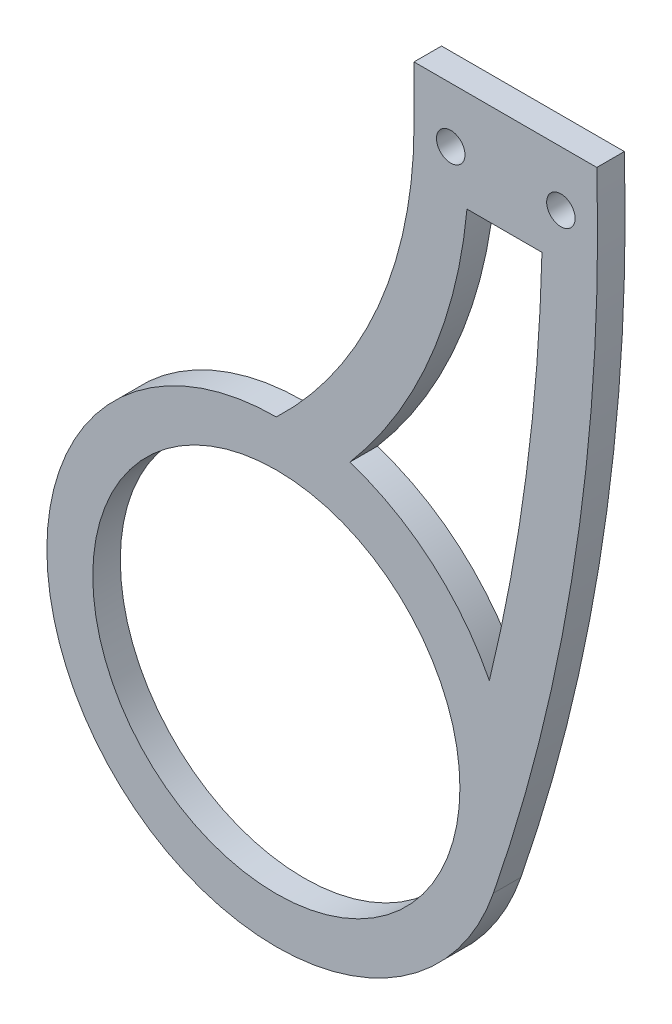
ISO-10303-21;
HEADER;
FILE_DESCRIPTION(('STEP AP214'),'2;1');
FILE_NAME('part.step','',(''),(''),'','','');
FILE_SCHEMA(('AUTOMOTIVE_DESIGN { 1 0 10303 214 1 1 1 1 }'));
ENDSEC;
DATA;
#1=APPLICATION_CONTEXT('core data for automotive mechanical design processes');
#2=APPLICATION_PROTOCOL_DEFINITION('international standard','automotive_design',2000,#1);
#3=PRODUCT_CONTEXT('',#1,'mechanical');
#4=PRODUCT('Part','Part','',(#3));
#5=PRODUCT_RELATED_PRODUCT_CATEGORY('part','',(#4));
#6=PRODUCT_DEFINITION_FORMATION('','',#4);
#7=PRODUCT_DEFINITION_CONTEXT('part definition',#1,'design');
#8=PRODUCT_DEFINITION('design','',#6,#7);
#9=PRODUCT_DEFINITION_SHAPE('','',#8);
#10=(LENGTH_UNIT() NAMED_UNIT(*) SI_UNIT(.MILLI.,.METRE.));
#11=(NAMED_UNIT(*) PLANE_ANGLE_UNIT() SI_UNIT($,.RADIAN.));
#12=(NAMED_UNIT(*) SI_UNIT($,.STERADIAN.) SOLID_ANGLE_UNIT());
#13=UNCERTAINTY_MEASURE_WITH_UNIT(LENGTH_MEASURE(1.E-05),#10,'distance_accuracy_value','');
#14=(GEOMETRIC_REPRESENTATION_CONTEXT(3) GLOBAL_UNCERTAINTY_ASSIGNED_CONTEXT((#13)) GLOBAL_UNIT_ASSIGNED_CONTEXT((#10,
#11,#12)) REPRESENTATION_CONTEXT('',''));
#15=CARTESIAN_POINT('',(0.,0.,0.));
#16=DIRECTION('',(0.,0.,1.));
#17=DIRECTION('',(1.,0.,0.));
#18=AXIS2_PLACEMENT_3D('',#15,#16,#17);
#19=CARTESIAN_POINT('',(-194.,0.,3.));
#20=DIRECTION('',(0.,0.,-1.));
#21=DIRECTION('',(-1.,0.,0.));
#22=AXIS2_PLACEMENT_3D('',#19,#20,#21);
#23=CYLINDRICAL_SURFACE('',#22,210.);
#24=CARTESIAN_POINT('',(-194.,0.,0.));
#25=DIRECTION('',(0.,0.,1.));
#26=DIRECTION('',(1.,0.,0.));
#27=AXIS2_PLACEMENT_3D('',#24,#25,#26);
#28=CIRCLE('',#27,210.);
#29=CARTESIAN_POINT('',(4.64864864864865,-68.1081081081081,0.));
#30=VERTEX_POINT('',#29);
#31=CARTESIAN_POINT('',(15.9142682144308,6.,0.));
#32=VERTEX_POINT('',#31);
#33=EDGE_CURVE('E161',#30,#32,#28,.T.);
#34=ORIENTED_EDGE('',*,*,#33,.T.);
#35=DIRECTION('',(0.,0.,-1.));
#36=VECTOR('',#35,1.);
#37=CARTESIAN_POINT('',(15.9142682144308,6.,3.));
#38=LINE('',#37,#36);
#39=CARTESIAN_POINT('',(15.9142682144308,6.,3.));
#40=VERTEX_POINT('',#39);
#41=EDGE_CURVE('E11',#40,#32,#38,.T.);
#42=ORIENTED_EDGE('',*,*,#41,.F.);
#43=CARTESIAN_POINT('',(-194.,0.,3.));
#44=DIRECTION('',(0.,0.,1.));
#45=DIRECTION('',(1.,0.,0.));
#46=AXIS2_PLACEMENT_3D('',#43,#44,#45);
#47=CIRCLE('',#46,210.);
#48=CARTESIAN_POINT('',(4.64864864864865,-68.1081081081081,3.));
#49=VERTEX_POINT('',#48);
#50=EDGE_CURVE('E135',#49,#40,#47,.T.);
#51=ORIENTED_EDGE('',*,*,#50,.F.);
#52=DIRECTION('',(0.,0.,-1.));
#53=VECTOR('',#52,1.);
#54=CARTESIAN_POINT('',(4.64864864864865,-68.1081081081081,3.));
#55=LINE('',#54,#53);
#56=EDGE_CURVE('E171',#49,#30,#55,.T.);
#57=ORIENTED_EDGE('',*,*,#56,.T.);
#58=EDGE_LOOP('',(#34,#42,#51,#57));
#59=FACE_BOUND('',#58,.T.);
#60=ADVANCED_FACE('F36',(#59),#23,.T.);
#61=CARTESIAN_POINT('',(0.,6.,3.));
#62=DIRECTION('',(0.,1.,0.));
#63=DIRECTION('',(-1.,0.,0.));
#64=AXIS2_PLACEMENT_3D('',#61,#62,#63);
#65=PLANE('',#64);
#66=DIRECTION('',(1.,0.,0.));
#67=VECTOR('',#66,1.);
#68=CARTESIAN_POINT('',(0.,6.,0.));
#69=LINE('',#68,#67);
#70=CARTESIAN_POINT('',(-4.,6.,0.));
#71=VERTEX_POINT('',#70);
#72=EDGE_CURVE('E164',#71,#32,#69,.T.);
#73=ORIENTED_EDGE('',*,*,#72,.F.);
#74=DIRECTION('',(0.,0.,-1.));
#75=VECTOR('',#74,1.);
#76=CARTESIAN_POINT('',(-4.,6.,3.));
#77=LINE('',#76,#75);
#78=CARTESIAN_POINT('',(-4.,6.,3.));
#79=VERTEX_POINT('',#78);
#80=EDGE_CURVE('E46',#79,#71,#77,.T.);
#81=ORIENTED_EDGE('',*,*,#80,.F.);
#82=DIRECTION('',(1.,0.,0.));
#83=VECTOR('',#82,1.);
#84=CARTESIAN_POINT('',(0.,6.,3.));
#85=LINE('',#84,#83);
#86=EDGE_CURVE('E133',#79,#40,#85,.T.);
#87=ORIENTED_EDGE('',*,*,#86,.T.);
#88=ORIENTED_EDGE('',*,*,#41,.T.);
#89=EDGE_LOOP('',(#73,#81,#87,#88));
#90=FACE_BOUND('',#89,.T.);
#91=ADVANCED_FACE('F220',(#90),#65,.T.);
#92=CARTESIAN_POINT('',(-4.,0.,3.));
#93=DIRECTION('',(-1.,0.,0.));
#94=DIRECTION('',(0.,-1.,0.));
#95=AXIS2_PLACEMENT_3D('',#92,#93,#94);
#96=PLANE('',#95);
#97=DIRECTION('',(0.,1.,0.));
#98=VECTOR('',#97,1.);
#99=CARTESIAN_POINT('',(-4.,0.,0.));
#100=LINE('',#99,#98);
#101=CARTESIAN_POINT('',(-4.,0.,0.));
#102=VERTEX_POINT('',#101);
#103=EDGE_CURVE('E124',#102,#71,#100,.T.);
#104=ORIENTED_EDGE('',*,*,#103,.F.);
#105=DIRECTION('',(0.,0.,-1.));
#106=VECTOR('',#105,1.);
#107=CARTESIAN_POINT('',(-4.,0.,3.));
#108=LINE('',#107,#106);
#109=CARTESIAN_POINT('',(-4.,0.,3.));
#110=VERTEX_POINT('',#109);
#111=EDGE_CURVE('E118',#110,#102,#108,.T.);
#112=ORIENTED_EDGE('',*,*,#111,.F.);
#113=DIRECTION('',(0.,1.,0.));
#114=VECTOR('',#113,1.);
#115=CARTESIAN_POINT('',(-4.,0.,3.));
#116=LINE('',#115,#114);
#117=EDGE_CURVE('E122',#110,#79,#116,.T.);
#118=ORIENTED_EDGE('',*,*,#117,.T.);
#119=ORIENTED_EDGE('',*,*,#80,.T.);
#120=EDGE_LOOP('',(#104,#112,#118,#119));
#121=FACE_BOUND('',#120,.T.);
#122=ADVANCED_FACE('F120',(#121),#96,.T.);
#123=CARTESIAN_POINT('',(-52.3333333333333,0.,3.));
#124=DIRECTION('',(0.,0.,-1.));
#125=DIRECTION('',(-1.,0.,0.));
#126=AXIS2_PLACEMENT_3D('',#123,#124,#125);
#127=CYLINDRICAL_SURFACE('',#126,48.3333333333333);
#128=CARTESIAN_POINT('',(-52.3333333333333,0.,0.));
#129=DIRECTION('',(0.,0.,1.));
#130=DIRECTION('',(1.,0.,0.));
#131=AXIS2_PLACEMENT_3D('',#128,#129,#130);
#132=CIRCLE('',#131,48.3333333333333);
#133=CARTESIAN_POINT('',(-19.,-35.,0.));
#134=VERTEX_POINT('',#133);
#135=EDGE_CURVE('E85',#102,#134,#132,.F.);
#136=ORIENTED_EDGE('',*,*,#135,.T.);
#137=DIRECTION('',(0.,0.,-1.));
#138=VECTOR('',#137,1.);
#139=CARTESIAN_POINT('',(-19.,-35.,3.));
#140=LINE('',#139,#138);
#141=CARTESIAN_POINT('',(-19.,-35.,3.));
#142=VERTEX_POINT('',#141);
#143=EDGE_CURVE('E125',#142,#134,#140,.T.);
#144=ORIENTED_EDGE('',*,*,#143,.F.);
#145=CARTESIAN_POINT('',(-52.3333333333333,0.,3.));
#146=DIRECTION('',(0.,0.,1.));
#147=DIRECTION('',(1.,0.,0.));
#148=AXIS2_PLACEMENT_3D('',#145,#146,#147);
#149=CIRCLE('',#148,48.3333333333333);
#150=EDGE_CURVE('E127',#110,#142,#149,.F.);
#151=ORIENTED_EDGE('',*,*,#150,.F.);
#152=ORIENTED_EDGE('',*,*,#111,.T.);
#153=EDGE_LOOP('',(#136,#144,#151,#152));
#154=FACE_BOUND('',#153,.T.);
#155=ADVANCED_FACE('F128',(#154),#127,.F.);
#156=CARTESIAN_POINT('',(-52.3333333333333,0.,3.));
#157=DIRECTION('',(0.,0.,-1.));
#158=DIRECTION('',(-1.,0.,0.));
#159=AXIS2_PLACEMENT_3D('',#156,#157,#158);
#160=CYLINDRICAL_SURFACE('',#159,54.3333333333333);
#161=CARTESIAN_POINT('',(-52.3333333333333,0.,0.));
#162=DIRECTION('',(0.,0.,1.));
#163=DIRECTION('',(1.,0.,0.));
#164=AXIS2_PLACEMENT_3D('',#161,#162,#163);
#165=CIRCLE('',#164,54.3333333333333);
#166=CARTESIAN_POINT('',(-10.997130100944,-35.2622945005245,0.));
#167=VERTEX_POINT('',#166);
#168=CARTESIAN_POINT('',(1.76944950739594,-5.,0.));
#169=VERTEX_POINT('',#168);
#170=EDGE_CURVE('E141',#167,#169,#165,.T.);
#171=ORIENTED_EDGE('',*,*,#170,.T.);
#172=DIRECTION('',(0.,0.,-1.));
#173=VECTOR('',#172,1.);
#174=CARTESIAN_POINT('',(1.76944950739594,-5.,3.));
#175=LINE('',#174,#173);
#176=CARTESIAN_POINT('',(1.76944950739594,-5.,3.));
#177=VERTEX_POINT('',#176);
#178=EDGE_CURVE('E40',#177,#169,#175,.T.);
#179=ORIENTED_EDGE('',*,*,#178,.F.);
#180=CARTESIAN_POINT('',(-52.3333333333333,0.,3.));
#181=DIRECTION('',(0.,0.,1.));
#182=DIRECTION('',(1.,0.,0.));
#183=AXIS2_PLACEMENT_3D('',#180,#181,#182);
#184=CIRCLE('',#183,54.3333333333333);
#185=CARTESIAN_POINT('',(-10.997130100944,-35.2622945005245,3.));
#186=VERTEX_POINT('',#185);
#187=EDGE_CURVE('E170',#186,#177,#184,.T.);
#188=ORIENTED_EDGE('',*,*,#187,.F.);
#189=DIRECTION('',(0.,0.,-1.));
#190=VECTOR('',#189,1.);
#191=CARTESIAN_POINT('',(-10.997130100944,-35.2622945005245,3.));
#192=LINE('',#191,#190);
#193=EDGE_CURVE('E140',#186,#167,#192,.T.);
#194=ORIENTED_EDGE('',*,*,#193,.T.);
#195=EDGE_LOOP('',(#171,#179,#188,#194));
#196=FACE_BOUND('',#195,.T.);
#197=ADVANCED_FACE('F38',(#196),#160,.T.);
#198=CARTESIAN_POINT('',(0.,-5.,3.));
#199=DIRECTION('',(0.,1.,0.));
#200=DIRECTION('',(0.,0.,1.));
#201=AXIS2_PLACEMENT_3D('',#198,#199,#200);
#202=PLANE('',#201);
#203=DIRECTION('',(1.,0.,0.));
#204=VECTOR('',#203,1.);
#205=CARTESIAN_POINT('',(0.,-5.,0.));
#206=LINE('',#205,#204);
#207=CARTESIAN_POINT('',(9.93871628506443,-5.,0.));
#208=VERTEX_POINT('',#207);
#209=EDGE_CURVE('E144',#169,#208,#206,.T.);
#210=ORIENTED_EDGE('',*,*,#209,.T.);
#211=DIRECTION('',(0.,0.,-1.));
#212=VECTOR('',#211,1.);
#213=CARTESIAN_POINT('',(9.93871628506443,-5.,3.));
#214=LINE('',#213,#212);
#215=CARTESIAN_POINT('',(9.93871628506443,-5.,3.));
#216=VERTEX_POINT('',#215);
#217=EDGE_CURVE('E178',#216,#208,#214,.T.);
#218=ORIENTED_EDGE('',*,*,#217,.F.);
#219=DIRECTION('',(1.,0.,0.));
#220=VECTOR('',#219,1.);
#221=CARTESIAN_POINT('',(0.,-5.,3.));
#222=LINE('',#221,#220);
#223=EDGE_CURVE('E100',#177,#216,#222,.T.);
#224=ORIENTED_EDGE('',*,*,#223,.F.);
#225=ORIENTED_EDGE('',*,*,#178,.T.);
#226=EDGE_LOOP('',(#210,#218,#224,#225));
#227=FACE_BOUND('',#226,.T.);
#228=ADVANCED_FACE('F183',(#227),#202,.F.);
#229=CARTESIAN_POINT('',(-194.,0.,3.));
#230=DIRECTION('',(0.,0.,-1.));
#231=DIRECTION('',(-1.,0.,0.));
#232=AXIS2_PLACEMENT_3D('',#229,#230,#231);
#233=CYLINDRICAL_SURFACE('',#232,204.);
#234=CARTESIAN_POINT('',(-194.,0.,0.));
#235=DIRECTION('',(0.,0.,1.));
#236=DIRECTION('',(1.,0.,0.));
#237=AXIS2_PLACEMENT_3D('',#234,#235,#236);
#238=CIRCLE('',#237,204.);
#239=CARTESIAN_POINT('',(4.20588151576232,-48.2745122456932,0.));
#240=VERTEX_POINT('',#239);
#241=EDGE_CURVE('E147',#240,#208,#238,.T.);
#242=ORIENTED_EDGE('',*,*,#241,.F.);
#243=DIRECTION('',(0.,0.,-1.));
#244=VECTOR('',#243,1.);
#245=CARTESIAN_POINT('',(4.20588151576232,-48.2745122456932,3.));
#246=LINE('',#245,#244);
#247=CARTESIAN_POINT('',(4.20588151576232,-48.2745122456932,3.));
#248=VERTEX_POINT('',#247);
#249=EDGE_CURVE('E177',#248,#240,#246,.T.);
#250=ORIENTED_EDGE('',*,*,#249,.F.);
#251=CARTESIAN_POINT('',(-194.,0.,3.));
#252=DIRECTION('',(0.,0.,1.));
#253=DIRECTION('',(1.,0.,0.));
#254=AXIS2_PLACEMENT_3D('',#251,#252,#253);
#255=CIRCLE('',#254,204.);
#256=EDGE_CURVE('E195',#248,#216,#255,.T.);
#257=ORIENTED_EDGE('',*,*,#256,.T.);
#258=ORIENTED_EDGE('',*,*,#217,.T.);
#259=EDGE_LOOP('',(#242,#250,#257,#258));
#260=FACE_BOUND('',#259,.T.);
#261=ADVANCED_FACE('F192',(#260),#233,.F.);
#262=CARTESIAN_POINT('',(-19.,-60.,3.));
#263=DIRECTION('',(0.,0.,-1.));
#264=DIRECTION('',(-1.,0.,0.));
#265=AXIS2_PLACEMENT_3D('',#262,#263,#264);
#266=CYLINDRICAL_SURFACE('',#265,20.);
#267=CARTESIAN_POINT('',(-19.,-60.,3.));
#268=DIRECTION('',(0.,0.,1.));
#269=DIRECTION('',(1.,0.,0.));
#270=AXIS2_PLACEMENT_3D('',#267,#268,#269);
#271=CIRCLE('',#270,20.);
#272=CARTESIAN_POINT('',(1.,-60.,3.));
#273=VERTEX_POINT('',#272);
#274=EDGE_CURVE('E212',#273,#273,#271,.T.);
#275=ORIENTED_EDGE('',*,*,#274,.T.);
#276=EDGE_LOOP('',(#275));
#277=FACE_BOUND('',#276,.T.);
#278=CARTESIAN_POINT('',(-19.,-60.,0.));
#279=DIRECTION('',(0.,0.,1.));
#280=DIRECTION('',(1.,0.,0.));
#281=AXIS2_PLACEMENT_3D('',#278,#279,#280);
#282=CIRCLE('',#281,20.);
#283=CARTESIAN_POINT('',(1.,-60.,0.));
#284=VERTEX_POINT('',#283);
#285=EDGE_CURVE('E158',#284,#284,#282,.T.);
#286=ORIENTED_EDGE('',*,*,#285,.F.);
#287=EDGE_LOOP('',(#286));
#288=FACE_BOUND('',#287,.T.);
#289=ADVANCED_FACE('F238',(#277,#288),#266,.F.);
#290=CARTESIAN_POINT('',(12.,0.,3.));
#291=DIRECTION('',(0.,0.,-1.));
#292=DIRECTION('',(-1.,0.,0.));
#293=AXIS2_PLACEMENT_3D('',#290,#291,#292);
#294=CYLINDRICAL_SURFACE('',#293,1.55);
#295=CARTESIAN_POINT('',(12.,0.,3.));
#296=DIRECTION('',(0.,0.,1.));
#297=DIRECTION('',(1.,0.,0.));
#298=AXIS2_PLACEMENT_3D('',#295,#296,#297);
#299=CIRCLE('',#298,1.55);
#300=CARTESIAN_POINT('',(13.55,0.,3.));
#301=VERTEX_POINT('',#300);
#302=EDGE_CURVE('E209',#301,#301,#299,.T.);
#303=ORIENTED_EDGE('',*,*,#302,.T.);
#304=EDGE_LOOP('',(#303));
#305=FACE_BOUND('',#304,.T.);
#306=CARTESIAN_POINT('',(12.,0.,0.));
#307=DIRECTION('',(0.,0.,1.));
#308=DIRECTION('',(1.,0.,0.));
#309=AXIS2_PLACEMENT_3D('',#306,#307,#308);
#310=CIRCLE('',#309,1.55);
#311=CARTESIAN_POINT('',(13.55,0.,0.));
#312=VERTEX_POINT('',#311);
#313=EDGE_CURVE('E155',#312,#312,#310,.T.);
#314=ORIENTED_EDGE('',*,*,#313,.F.);
#315=EDGE_LOOP('',(#314));
#316=FACE_BOUND('',#315,.T.);
#317=ADVANCED_FACE('F241',(#305,#316),#294,.F.);
#318=CARTESIAN_POINT('',(0.,0.,3.));
#319=DIRECTION('',(0.,0.,-1.));
#320=DIRECTION('',(-1.,0.,0.));
#321=AXIS2_PLACEMENT_3D('',#318,#319,#320);
#322=CYLINDRICAL_SURFACE('',#321,1.55);
#323=CARTESIAN_POINT('',(0.,0.,3.));
#324=DIRECTION('',(0.,0.,1.));
#325=DIRECTION('',(1.,0.,0.));
#326=AXIS2_PLACEMENT_3D('',#323,#324,#325);
#327=CIRCLE('',#326,1.55);
#328=CARTESIAN_POINT('',(1.55,0.,3.));
#329=VERTEX_POINT('',#328);
#330=EDGE_CURVE('E200',#329,#329,#327,.T.);
#331=ORIENTED_EDGE('',*,*,#330,.T.);
#332=EDGE_LOOP('',(#331));
#333=FACE_BOUND('',#332,.T.);
#334=CARTESIAN_POINT('',(0.,0.,0.));
#335=DIRECTION('',(0.,0.,1.));
#336=DIRECTION('',(1.,0.,0.));
#337=AXIS2_PLACEMENT_3D('',#334,#335,#336);
#338=CIRCLE('',#337,1.55);
#339=CARTESIAN_POINT('',(1.55,0.,0.));
#340=VERTEX_POINT('',#339);
#341=EDGE_CURVE('E152',#340,#340,#338,.T.);
#342=ORIENTED_EDGE('',*,*,#341,.F.);
#343=EDGE_LOOP('',(#342));
#344=FACE_BOUND('',#343,.T.);
#345=ADVANCED_FACE('F245',(#333,#344),#322,.F.);
#346=CARTESIAN_POINT('',(-19.,-60.,3.));
#347=DIRECTION('',(0.,0.,-1.));
#348=DIRECTION('',(-1.,0.,0.));
#349=AXIS2_PLACEMENT_3D('',#346,#347,#348);
#350=CYLINDRICAL_SURFACE('',#349,26.);
#351=CARTESIAN_POINT('',(-19.,-60.,0.));
#352=DIRECTION('',(0.,0.,1.));
#353=DIRECTION('',(1.,0.,0.));
#354=AXIS2_PLACEMENT_3D('',#351,#352,#353);
#355=CIRCLE('',#354,26.);
#356=EDGE_CURVE('E150',#240,#167,#355,.T.);
#357=ORIENTED_EDGE('',*,*,#356,.T.);
#358=ORIENTED_EDGE('',*,*,#193,.F.);
#359=CARTESIAN_POINT('',(-19.,-60.,3.));
#360=DIRECTION('',(0.,0.,1.));
#361=DIRECTION('',(1.,0.,0.));
#362=AXIS2_PLACEMENT_3D('',#359,#360,#361);
#363=CIRCLE('',#362,26.);
#364=EDGE_CURVE('E197',#248,#186,#363,.T.);
#365=ORIENTED_EDGE('',*,*,#364,.F.);
#366=ORIENTED_EDGE('',*,*,#249,.T.);
#367=EDGE_LOOP('',(#357,#358,#365,#366));
#368=FACE_BOUND('',#367,.T.);
#369=ADVANCED_FACE('F198',(#368),#350,.T.);
#370=CARTESIAN_POINT('',(-19.,-60.,3.));
#371=DIRECTION('',(0.,0.,-1.));
#372=DIRECTION('',(-1.,0.,0.));
#373=AXIS2_PLACEMENT_3D('',#370,#371,#372);
#374=CYLINDRICAL_SURFACE('',#373,25.);
#375=CARTESIAN_POINT('',(-19.,-60.,0.));
#376=DIRECTION('',(0.,0.,1.));
#377=DIRECTION('',(1.,0.,0.));
#378=AXIS2_PLACEMENT_3D('',#375,#376,#377);
#379=CIRCLE('',#378,25.);
#380=EDGE_CURVE('E91',#134,#30,#379,.T.);
#381=ORIENTED_EDGE('',*,*,#380,.T.);
#382=ORIENTED_EDGE('',*,*,#56,.F.);
#383=CARTESIAN_POINT('',(-19.,-60.,3.));
#384=DIRECTION('',(0.,0.,1.));
#385=DIRECTION('',(1.,0.,0.));
#386=AXIS2_PLACEMENT_3D('',#383,#384,#385);
#387=CIRCLE('',#386,25.);
#388=EDGE_CURVE('E55',#142,#49,#387,.T.);
#389=ORIENTED_EDGE('',*,*,#388,.F.);
#390=ORIENTED_EDGE('',*,*,#143,.T.);
#391=EDGE_LOOP('',(#381,#382,#389,#390));
#392=FACE_BOUND('',#391,.T.);
#393=ADVANCED_FACE('F227',(#392),#374,.T.);
#394=CARTESIAN_POINT('',(0.,0.,3.));
#395=DIRECTION('',(0.,0.,1.));
#396=DIRECTION('',(1.,0.,0.));
#397=AXIS2_PLACEMENT_3D('',#394,#395,#396);
#398=PLANE('',#397);
#399=ORIENTED_EDGE('',*,*,#187,.T.);
#400=ORIENTED_EDGE('',*,*,#223,.T.);
#401=ORIENTED_EDGE('',*,*,#256,.F.);
#402=ORIENTED_EDGE('',*,*,#364,.T.);
#403=EDGE_LOOP('',(#399,#400,#401,#402));
#404=FACE_BOUND('',#403,.T.);
#405=ORIENTED_EDGE('',*,*,#330,.F.);
#406=EDGE_LOOP('',(#405));
#407=FACE_BOUND('',#406,.T.);
#408=ORIENTED_EDGE('',*,*,#302,.F.);
#409=EDGE_LOOP('',(#408));
#410=FACE_BOUND('',#409,.T.);
#411=ORIENTED_EDGE('',*,*,#274,.F.);
#412=EDGE_LOOP('',(#411));
#413=FACE_BOUND('',#412,.T.);
#414=ORIENTED_EDGE('',*,*,#50,.T.);
#415=ORIENTED_EDGE('',*,*,#86,.F.);
#416=ORIENTED_EDGE('',*,*,#117,.F.);
#417=ORIENTED_EDGE('',*,*,#150,.T.);
#418=ORIENTED_EDGE('',*,*,#388,.T.);
#419=EDGE_LOOP('',(#414,#415,#416,#417,#418));
#420=FACE_BOUND('',#419,.T.);
#421=ADVANCED_FACE('F131',(#404,#407,#410,#413,#420),#398,.T.);
#422=CARTESIAN_POINT('',(0.,0.,0.));
#423=DIRECTION('',(0.,0.,1.));
#424=DIRECTION('',(1.,0.,0.));
#425=AXIS2_PLACEMENT_3D('',#422,#423,#424);
#426=PLANE('',#425);
#427=ORIENTED_EDGE('',*,*,#170,.F.);
#428=ORIENTED_EDGE('',*,*,#356,.F.);
#429=ORIENTED_EDGE('',*,*,#241,.T.);
#430=ORIENTED_EDGE('',*,*,#209,.F.);
#431=EDGE_LOOP('',(#427,#428,#429,#430));
#432=FACE_BOUND('',#431,.T.);
#433=ORIENTED_EDGE('',*,*,#341,.T.);
#434=EDGE_LOOP('',(#433));
#435=FACE_BOUND('',#434,.T.);
#436=ORIENTED_EDGE('',*,*,#313,.T.);
#437=EDGE_LOOP('',(#436));
#438=FACE_BOUND('',#437,.T.);
#439=ORIENTED_EDGE('',*,*,#285,.T.);
#440=EDGE_LOOP('',(#439));
#441=FACE_BOUND('',#440,.T.);
#442=ORIENTED_EDGE('',*,*,#33,.F.);
#443=ORIENTED_EDGE('',*,*,#380,.F.);
#444=ORIENTED_EDGE('',*,*,#135,.F.);
#445=ORIENTED_EDGE('',*,*,#103,.T.);
#446=ORIENTED_EDGE('',*,*,#72,.T.);
#447=EDGE_LOOP('',(#442,#443,#444,#445,#446));
#448=FACE_BOUND('',#447,.T.);
#449=ADVANCED_FACE('F190',(#432,#435,#438,#441,#448),#426,.F.);
#450=CLOSED_SHELL('',(#60,#91,#122,#155,#197,#228,#261,#289,#317,#345,#369,#393,#421,#449));
#451=MANIFOLD_SOLID_BREP('B2',#450);
#452=ADVANCED_BREP_SHAPE_REPRESENTATION('',(#18,#451),#14);
#453=SHAPE_DEFINITION_REPRESENTATION(#9,#452);
ENDSEC;
END-ISO-10303-21;
